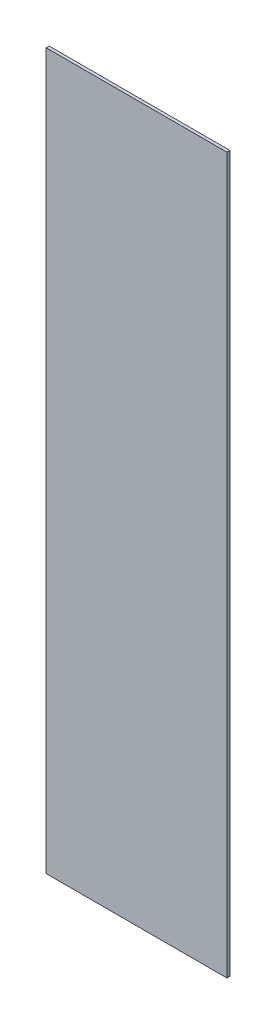
ISO-10303-21;
HEADER;
FILE_DESCRIPTION(('STEP AP214'),'2;1');
FILE_NAME('part.step','',(''),(''),'','','');
FILE_SCHEMA(('AUTOMOTIVE_DESIGN { 1 0 10303 214 1 1 1 1 }'));
ENDSEC;
DATA;
#1=APPLICATION_CONTEXT('core data for automotive mechanical design processes');
#2=APPLICATION_PROTOCOL_DEFINITION('international standard','automotive_design',2000,#1);
#3=PRODUCT_CONTEXT('',#1,'mechanical');
#4=PRODUCT('Part','Part','',(#3));
#5=PRODUCT_RELATED_PRODUCT_CATEGORY('part','',(#4));
#6=PRODUCT_DEFINITION_FORMATION('','',#4);
#7=PRODUCT_DEFINITION_CONTEXT('part definition',#1,'design');
#8=PRODUCT_DEFINITION('design','',#6,#7);
#9=PRODUCT_DEFINITION_SHAPE('','',#8);
#10=(LENGTH_UNIT() NAMED_UNIT(*) SI_UNIT(.MILLI.,.METRE.));
#11=(NAMED_UNIT(*) PLANE_ANGLE_UNIT() SI_UNIT($,.RADIAN.));
#12=(NAMED_UNIT(*) SI_UNIT($,.STERADIAN.) SOLID_ANGLE_UNIT());
#13=UNCERTAINTY_MEASURE_WITH_UNIT(LENGTH_MEASURE(1.E-05),#10,'distance_accuracy_value','');
#14=(GEOMETRIC_REPRESENTATION_CONTEXT(3) GLOBAL_UNCERTAINTY_ASSIGNED_CONTEXT((#13)) GLOBAL_UNIT_ASSIGNED_CONTEXT((#10,
#11,#12)) REPRESENTATION_CONTEXT('',''));
#15=CARTESIAN_POINT('',(0.,0.,0.));
#16=DIRECTION('',(0.,0.,1.));
#17=DIRECTION('',(1.,0.,0.));
#18=AXIS2_PLACEMENT_3D('',#15,#16,#17);
#19=CARTESIAN_POINT('',(0.123163379977,0.320721575439,0.002950587767671));
#20=DIRECTION('',(-1.,0.,0.));
#21=DIRECTION('',(0.,0.,1.));
#22=AXIS2_PLACEMENT_3D('',#19,#20,#21);
#23=PLANE('',#22);
#24=DIRECTION('',(0.,0.,1.));
#25=VECTOR('',#24,1.);
#26=CARTESIAN_POINT('',(0.123163379977,0.140663797661,-4.94122323289E-05));
#27=LINE('',#26,#25);
#28=CARTESIAN_POINT('',(0.123163379977,0.140663797661,-4.94122323289E-05));
#29=VERTEX_POINT('',#28);
#30=CARTESIAN_POINT('',(0.123163379977,0.140663797661,0.002950587767671));
#31=VERTEX_POINT('',#30);
#32=EDGE_CURVE('E11',#29,#31,#27,.T.);
#33=ORIENTED_EDGE('',*,*,#32,.T.);
#34=DIRECTION('',(0.,1.,0.));
#35=VECTOR('',#34,1.);
#36=CARTESIAN_POINT('',(0.123163379977,0.140663797661,0.002950587767671));
#37=LINE('',#36,#35);
#38=CARTESIAN_POINT('',(0.123163379977,0.500779353217,0.002950587767671));
#39=VERTEX_POINT('',#38);
#40=EDGE_CURVE('E24',#31,#39,#37,.T.);
#41=ORIENTED_EDGE('',*,*,#40,.T.);
#42=DIRECTION('',(0.,0.,1.));
#43=VECTOR('',#42,1.);
#44=CARTESIAN_POINT('',(0.123163379977,0.500779353217,-4.94122323289E-05));
#45=LINE('',#44,#43);
#46=CARTESIAN_POINT('',(0.123163379977,0.500779353217,-4.94122323289E-05));
#47=VERTEX_POINT('',#46);
#48=EDGE_CURVE('E99',#47,#39,#45,.T.);
#49=ORIENTED_EDGE('',*,*,#48,.F.);
#50=DIRECTION('',(0.,1.,0.));
#51=VECTOR('',#50,1.);
#52=CARTESIAN_POINT('',(0.123163379977,0.140663797661,-4.94122323289E-05));
#53=LINE('',#52,#51);
#54=EDGE_CURVE('E97',#29,#47,#53,.T.);
#55=ORIENTED_EDGE('',*,*,#54,.F.);
#56=EDGE_LOOP('',(#33,#41,#49,#55));
#57=FACE_BOUND('',#56,.T.);
#58=ADVANCED_FACE('F17',(#57),#23,.T.);
#59=CARTESIAN_POINT('',(0.214227042288,0.500779353217,0.002950587767671));
#60=DIRECTION('',(0.,1.,0.));
#61=DIRECTION('',(0.,0.,1.));
#62=AXIS2_PLACEMENT_3D('',#59,#60,#61);
#63=PLANE('',#62);
#64=ORIENTED_EDGE('',*,*,#48,.T.);
#65=DIRECTION('',(1.,0.,0.));
#66=VECTOR('',#65,1.);
#67=CARTESIAN_POINT('',(0.123163379977,0.500779353217,0.002950587767671));
#68=LINE('',#67,#66);
#69=CARTESIAN_POINT('',(0.305290704599,0.500779353217,0.002950587767671));
#70=VERTEX_POINT('',#69);
#71=EDGE_CURVE('E95',#39,#70,#68,.T.);
#72=ORIENTED_EDGE('',*,*,#71,.T.);
#73=DIRECTION('',(0.,0.,1.));
#74=VECTOR('',#73,1.);
#75=CARTESIAN_POINT('',(0.305290704599,0.500779353217,-4.94122323289E-05));
#76=LINE('',#75,#74);
#77=CARTESIAN_POINT('',(0.305290704599,0.500779353217,-4.94122323289E-05));
#78=VERTEX_POINT('',#77);
#79=EDGE_CURVE('E92',#78,#70,#76,.T.);
#80=ORIENTED_EDGE('',*,*,#79,.F.);
#81=DIRECTION('',(1.,0.,0.));
#82=VECTOR('',#81,1.);
#83=CARTESIAN_POINT('',(0.123163379977,0.500779353217,-4.94122323289E-05));
#84=LINE('',#83,#82);
#85=EDGE_CURVE('E90',#47,#78,#84,.T.);
#86=ORIENTED_EDGE('',*,*,#85,.F.);
#87=EDGE_LOOP('',(#64,#72,#80,#86));
#88=FACE_BOUND('',#87,.T.);
#89=ADVANCED_FACE('F105',(#88),#63,.T.);
#90=CARTESIAN_POINT('',(0.305290704599,0.1406637976615,0.002950587767671));
#91=DIRECTION('',(1.,0.,0.));
#92=DIRECTION('',(0.,0.,-1.));
#93=AXIS2_PLACEMENT_3D('',#90,#91,#92);
#94=PLANE('',#93);
#95=ORIENTED_EDGE('',*,*,#79,.T.);
#96=DIRECTION('',(0.,-1.,0.));
#97=VECTOR('',#96,1.);
#98=CARTESIAN_POINT('',(0.305290704599,0.500779353217,0.002950587767671));
#99=LINE('',#98,#97);
#100=CARTESIAN_POINT('',(0.305290704599,-0.219451757894,0.002950587767671));
#101=VERTEX_POINT('',#100);
#102=EDGE_CURVE('E88',#70,#101,#99,.T.);
#103=ORIENTED_EDGE('',*,*,#102,.T.);
#104=DIRECTION('',(0.,0.,1.));
#105=VECTOR('',#104,1.);
#106=CARTESIAN_POINT('',(0.305290704599,-0.219451757894,-4.94122323289E-05));
#107=LINE('',#106,#105);
#108=CARTESIAN_POINT('',(0.305290704599,-0.219451757894,-4.94122323289E-05));
#109=VERTEX_POINT('',#108);
#110=EDGE_CURVE('E86',#109,#101,#107,.T.);
#111=ORIENTED_EDGE('',*,*,#110,.F.);
#112=DIRECTION('',(0.,-1.,0.));
#113=VECTOR('',#112,1.);
#114=CARTESIAN_POINT('',(0.305290704599,0.500779353217,-4.94122323289E-05));
#115=LINE('',#114,#113);
#116=EDGE_CURVE('E77',#78,#109,#115,.T.);
#117=ORIENTED_EDGE('',*,*,#116,.F.);
#118=EDGE_LOOP('',(#95,#103,#111,#117));
#119=FACE_BOUND('',#118,.T.);
#120=ADVANCED_FACE('F109',(#119),#94,.T.);
#121=CARTESIAN_POINT('',(0.214227042288,-0.219451757894,0.002950587767671));
#122=DIRECTION('',(0.,-1.,0.));
#123=DIRECTION('',(0.,0.,-1.));
#124=AXIS2_PLACEMENT_3D('',#121,#122,#123);
#125=PLANE('',#124);
#126=ORIENTED_EDGE('',*,*,#110,.T.);
#127=DIRECTION('',(-1.,0.,0.));
#128=VECTOR('',#127,1.);
#129=CARTESIAN_POINT('',(0.305290704599,-0.219451757894,0.002950587767671));
#130=LINE('',#129,#128);
#131=CARTESIAN_POINT('',(0.123163379977,-0.219451757894,0.002950587767671));
#132=VERTEX_POINT('',#131);
#133=EDGE_CURVE('E66',#101,#132,#130,.T.);
#134=ORIENTED_EDGE('',*,*,#133,.T.);
#135=DIRECTION('',(0.,0.,1.));
#136=VECTOR('',#135,1.);
#137=CARTESIAN_POINT('',(0.123163379977,-0.219451757894,-4.94122323289E-05));
#138=LINE('',#137,#136);
#139=CARTESIAN_POINT('',(0.123163379977,-0.219451757894,-4.94122323289E-05));
#140=VERTEX_POINT('',#139);
#141=EDGE_CURVE('E60',#140,#132,#138,.T.);
#142=ORIENTED_EDGE('',*,*,#141,.F.);
#143=DIRECTION('',(-1.,0.,0.));
#144=VECTOR('',#143,1.);
#145=CARTESIAN_POINT('',(0.305290704599,-0.219451757894,-4.94122323289E-05));
#146=LINE('',#145,#144);
#147=EDGE_CURVE('E64',#109,#140,#146,.T.);
#148=ORIENTED_EDGE('',*,*,#147,.F.);
#149=EDGE_LOOP('',(#126,#134,#142,#148));
#150=FACE_BOUND('',#149,.T.);
#151=ADVANCED_FACE('F63',(#150),#125,.T.);
#152=CARTESIAN_POINT('',(0.123163379977,-0.0393939801165,0.002950587767671));
#153=DIRECTION('',(-1.,0.,0.));
#154=DIRECTION('',(0.,0.,1.));
#155=AXIS2_PLACEMENT_3D('',#152,#153,#154);
#156=PLANE('',#155);
#157=ORIENTED_EDGE('',*,*,#141,.T.);
#158=DIRECTION('',(0.,1.,0.));
#159=VECTOR('',#158,1.);
#160=CARTESIAN_POINT('',(0.123163379977,-0.219451757894,0.002950587767671));
#161=LINE('',#160,#159);
#162=EDGE_CURVE('E78',#132,#31,#161,.T.);
#163=ORIENTED_EDGE('',*,*,#162,.T.);
#164=ORIENTED_EDGE('',*,*,#32,.F.);
#165=DIRECTION('',(0.,1.,0.));
#166=VECTOR('',#165,1.);
#167=CARTESIAN_POINT('',(0.123163379977,-0.219451757894,-4.94122323289E-05));
#168=LINE('',#167,#166);
#169=EDGE_CURVE('E74',#140,#29,#168,.T.);
#170=ORIENTED_EDGE('',*,*,#169,.F.);
#171=EDGE_LOOP('',(#157,#163,#164,#170));
#172=FACE_BOUND('',#171,.T.);
#173=ADVANCED_FACE('F80',(#172),#156,.T.);
#174=CARTESIAN_POINT('',(0.214227042288,-0.219451757894,-4.94122323289E-05));
#175=DIRECTION('',(0.,0.,1.));
#176=DIRECTION('',(1.,0.,0.));
#177=AXIS2_PLACEMENT_3D('',#174,#175,#176);
#178=PLANE('',#177);
#179=ORIENTED_EDGE('',*,*,#54,.T.);
#180=ORIENTED_EDGE('',*,*,#85,.T.);
#181=ORIENTED_EDGE('',*,*,#116,.T.);
#182=ORIENTED_EDGE('',*,*,#147,.T.);
#183=ORIENTED_EDGE('',*,*,#169,.T.);
#184=EDGE_LOOP('',(#179,#180,#181,#182,#183));
#185=FACE_BOUND('',#184,.T.);
#186=ADVANCED_FACE('F73',(#185),#178,.F.);
#187=CARTESIAN_POINT('',(0.214227042288,-0.219451757894,0.002950587767671));
#188=DIRECTION('',(0.,0.,1.));
#189=DIRECTION('',(1.,0.,0.));
#190=AXIS2_PLACEMENT_3D('',#187,#188,#189);
#191=PLANE('',#190);
#192=ORIENTED_EDGE('',*,*,#40,.F.);
#193=ORIENTED_EDGE('',*,*,#162,.F.);
#194=ORIENTED_EDGE('',*,*,#133,.F.);
#195=ORIENTED_EDGE('',*,*,#102,.F.);
#196=ORIENTED_EDGE('',*,*,#71,.F.);
#197=EDGE_LOOP('',(#192,#193,#194,#195,#196));
#198=FACE_BOUND('',#197,.T.);
#199=ADVANCED_FACE('F107',(#198),#191,.T.);
#200=CLOSED_SHELL('',(#58,#89,#120,#151,#173,#186,#199));
#201=MANIFOLD_SOLID_BREP('B1',#200);
#202=ADVANCED_BREP_SHAPE_REPRESENTATION('',(#18,#201),#14);
#203=SHAPE_DEFINITION_REPRESENTATION(#9,#202);
ENDSEC;
END-ISO-10303-21;
